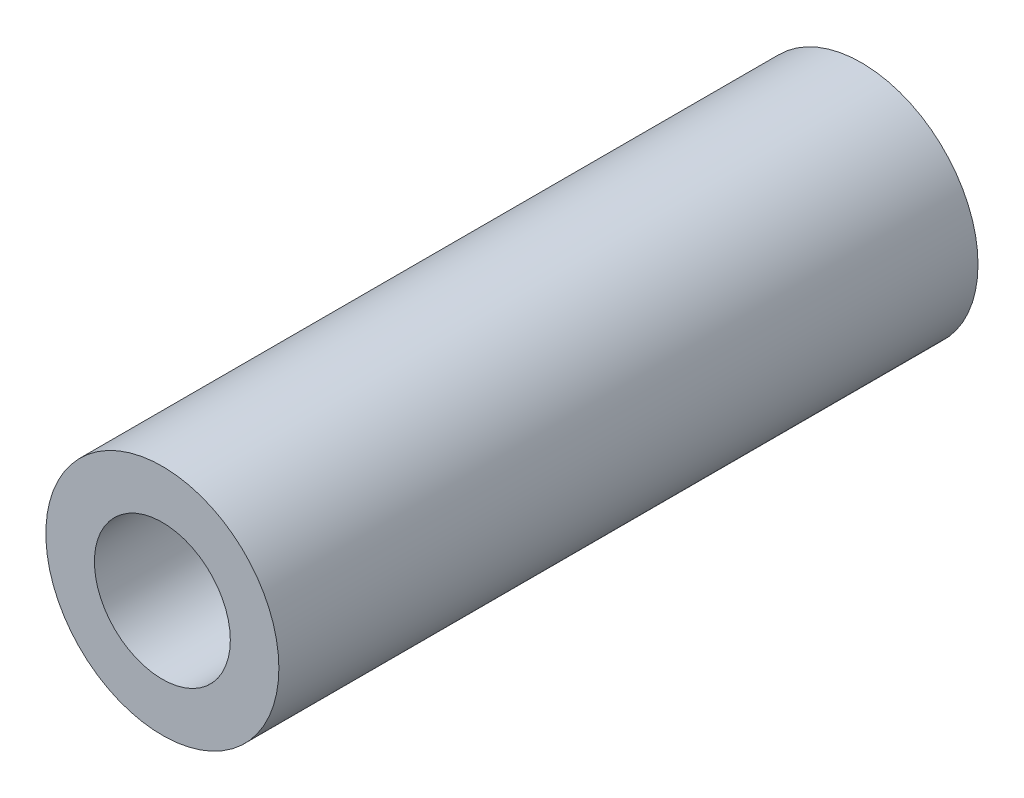
ISO-10303-21;
HEADER;
FILE_DESCRIPTION(('STEP AP214'),'2;1');
FILE_NAME('part.step','',(''),(''),'','','');
FILE_SCHEMA(('AUTOMOTIVE_DESIGN { 1 0 10303 214 1 1 1 1 }'));
ENDSEC;
DATA;
#1=APPLICATION_CONTEXT('core data for automotive mechanical design processes');
#2=APPLICATION_PROTOCOL_DEFINITION('international standard','automotive_design',2000,#1);
#3=PRODUCT_CONTEXT('',#1,'mechanical');
#4=PRODUCT('Part','Part','',(#3));
#5=PRODUCT_RELATED_PRODUCT_CATEGORY('part','',(#4));
#6=PRODUCT_DEFINITION_FORMATION('','',#4);
#7=PRODUCT_DEFINITION_CONTEXT('part definition',#1,'design');
#8=PRODUCT_DEFINITION('design','',#6,#7);
#9=PRODUCT_DEFINITION_SHAPE('','',#8);
#10=(LENGTH_UNIT() NAMED_UNIT(*) SI_UNIT(.MILLI.,.METRE.));
#11=(NAMED_UNIT(*) PLANE_ANGLE_UNIT() SI_UNIT($,.RADIAN.));
#12=(NAMED_UNIT(*) SI_UNIT($,.STERADIAN.) SOLID_ANGLE_UNIT());
#13=UNCERTAINTY_MEASURE_WITH_UNIT(LENGTH_MEASURE(1.E-05),#10,'distance_accuracy_value','');
#14=(GEOMETRIC_REPRESENTATION_CONTEXT(3) GLOBAL_UNCERTAINTY_ASSIGNED_CONTEXT((#13)) GLOBAL_UNIT_ASSIGNED_CONTEXT((#10,
#11,#12)) REPRESENTATION_CONTEXT('',''));
#15=CARTESIAN_POINT('',(0.,0.,0.));
#16=DIRECTION('',(0.,0.,1.));
#17=DIRECTION('',(1.,0.,0.));
#18=AXIS2_PLACEMENT_3D('',#15,#16,#17);
#19=CARTESIAN_POINT('',(0.,0.,18.));
#20=DIRECTION('',(0.,0.,1.));
#21=DIRECTION('',(1.,0.,0.));
#22=AXIS2_PLACEMENT_3D('',#19,#20,#21);
#23=PLANE('',#22);
#24=CARTESIAN_POINT('',(0.,0.,18.));
#25=DIRECTION('',(0.,0.,1.));
#26=DIRECTION('',(1.,0.,0.));
#27=AXIS2_PLACEMENT_3D('',#24,#25,#26);
#28=CIRCLE('',#27,3.);
#29=CARTESIAN_POINT('',(3.,0.,18.));
#30=VERTEX_POINT('',#29);
#31=EDGE_CURVE('E10',#30,#30,#28,.T.);
#32=ORIENTED_EDGE('',*,*,#31,.T.);
#33=EDGE_LOOP('',(#32));
#34=FACE_BOUND('',#33,.T.);
#35=CARTESIAN_POINT('',(0.,0.,18.));
#36=DIRECTION('',(0.,0.,1.));
#37=DIRECTION('',(1.,0.,0.));
#38=AXIS2_PLACEMENT_3D('',#35,#36,#37);
#39=CIRCLE('',#38,1.75);
#40=CARTESIAN_POINT('',(1.75,0.,18.));
#41=VERTEX_POINT('',#40);
#42=EDGE_CURVE('E50',#41,#41,#39,.T.);
#43=ORIENTED_EDGE('',*,*,#42,.F.);
#44=EDGE_LOOP('',(#43));
#45=FACE_BOUND('',#44,.T.);
#46=ADVANCED_FACE('F37',(#34,#45),#23,.T.);
#47=CARTESIAN_POINT('',(0.,0.,0.));
#48=DIRECTION('',(0.,0.,1.));
#49=DIRECTION('',(1.,0.,0.));
#50=AXIS2_PLACEMENT_3D('',#47,#48,#49);
#51=PLANE('',#50);
#52=CARTESIAN_POINT('',(0.,0.,0.));
#53=DIRECTION('',(0.,0.,1.));
#54=DIRECTION('',(1.,0.,0.));
#55=AXIS2_PLACEMENT_3D('',#52,#53,#54);
#56=CIRCLE('',#55,3.);
#57=CARTESIAN_POINT('',(3.,0.,0.));
#58=VERTEX_POINT('',#57);
#59=EDGE_CURVE('E41',#58,#58,#56,.T.);
#60=ORIENTED_EDGE('',*,*,#59,.F.);
#61=EDGE_LOOP('',(#60));
#62=FACE_BOUND('',#61,.T.);
#63=CARTESIAN_POINT('',(0.,0.,0.));
#64=DIRECTION('',(0.,0.,1.));
#65=DIRECTION('',(1.,0.,0.));
#66=AXIS2_PLACEMENT_3D('',#63,#64,#65);
#67=CIRCLE('',#66,1.75);
#68=CARTESIAN_POINT('',(1.75,0.,0.));
#69=VERTEX_POINT('',#68);
#70=EDGE_CURVE('E52',#69,#69,#67,.T.);
#71=ORIENTED_EDGE('',*,*,#70,.T.);
#72=EDGE_LOOP('',(#71));
#73=FACE_BOUND('',#72,.T.);
#74=ADVANCED_FACE('F64',(#62,#73),#51,.F.);
#75=CARTESIAN_POINT('',(0.,0.,18.));
#76=DIRECTION('',(0.,0.,-1.));
#77=DIRECTION('',(-1.,0.,0.));
#78=AXIS2_PLACEMENT_3D('',#75,#76,#77);
#79=CYLINDRICAL_SURFACE('',#78,3.);
#80=ORIENTED_EDGE('',*,*,#31,.F.);
#81=EDGE_LOOP('',(#80));
#82=FACE_BOUND('',#81,.T.);
#83=ORIENTED_EDGE('',*,*,#59,.T.);
#84=EDGE_LOOP('',(#83));
#85=FACE_BOUND('',#84,.T.);
#86=ADVANCED_FACE('F39',(#82,#85),#79,.T.);
#87=CARTESIAN_POINT('',(0.,0.,18.));
#88=DIRECTION('',(0.,0.,-1.));
#89=DIRECTION('',(-1.,0.,0.));
#90=AXIS2_PLACEMENT_3D('',#87,#88,#89);
#91=CYLINDRICAL_SURFACE('',#90,1.75);
#92=ORIENTED_EDGE('',*,*,#42,.T.);
#93=EDGE_LOOP('',(#92));
#94=FACE_BOUND('',#93,.T.);
#95=ORIENTED_EDGE('',*,*,#70,.F.);
#96=EDGE_LOOP('',(#95));
#97=FACE_BOUND('',#96,.T.);
#98=ADVANCED_FACE('F60',(#94,#97),#91,.F.);
#99=CLOSED_SHELL('',(#46,#74,#86,#98));
#100=MANIFOLD_SOLID_BREP('B2',#99);
#101=ADVANCED_BREP_SHAPE_REPRESENTATION('',(#18,#100),#14);
#102=SHAPE_DEFINITION_REPRESENTATION(#9,#101);
ENDSEC;
END-ISO-10303-21;
